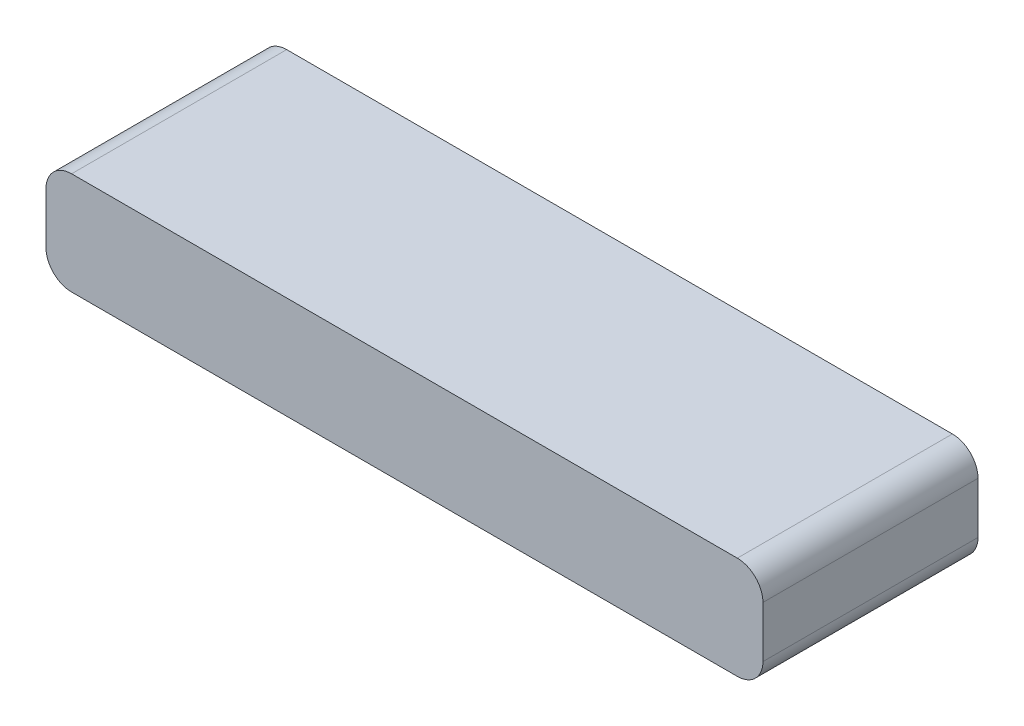
ISO-10303-21;
HEADER;
FILE_DESCRIPTION(('STEP AP214'),'2;1');
FILE_NAME('part.step','',(''),(''),'','','');
FILE_SCHEMA(('AUTOMOTIVE_DESIGN { 1 0 10303 214 1 1 1 1 }'));
ENDSEC;
DATA;
#1=APPLICATION_CONTEXT('core data for automotive mechanical design processes');
#2=APPLICATION_PROTOCOL_DEFINITION('international standard','automotive_design',2000,#1);
#3=PRODUCT_CONTEXT('',#1,'mechanical');
#4=PRODUCT('Part','Part','',(#3));
#5=PRODUCT_RELATED_PRODUCT_CATEGORY('part','',(#4));
#6=PRODUCT_DEFINITION_FORMATION('','',#4);
#7=PRODUCT_DEFINITION_CONTEXT('part definition',#1,'design');
#8=PRODUCT_DEFINITION('design','',#6,#7);
#9=PRODUCT_DEFINITION_SHAPE('','',#8);
#10=(LENGTH_UNIT() NAMED_UNIT(*) SI_UNIT(.MILLI.,.METRE.));
#11=(NAMED_UNIT(*) PLANE_ANGLE_UNIT() SI_UNIT($,.RADIAN.));
#12=(NAMED_UNIT(*) SI_UNIT($,.STERADIAN.) SOLID_ANGLE_UNIT());
#13=UNCERTAINTY_MEASURE_WITH_UNIT(LENGTH_MEASURE(1.E-05),#10,'distance_accuracy_value','');
#14=(GEOMETRIC_REPRESENTATION_CONTEXT(3) GLOBAL_UNCERTAINTY_ASSIGNED_CONTEXT((#13)) GLOBAL_UNIT_ASSIGNED_CONTEXT((#10,
#11,#12)) REPRESENTATION_CONTEXT('',''));
#15=CARTESIAN_POINT('',(0.,0.,0.));
#16=DIRECTION('',(0.,0.,1.));
#17=DIRECTION('',(1.,0.,0.));
#18=AXIS2_PLACEMENT_3D('',#15,#16,#17);
#19=CARTESIAN_POINT('',(0.,0.,0.));
#20=DIRECTION('',(0.,1.,0.));
#21=DIRECTION('',(0.,0.,1.));
#22=AXIS2_PLACEMENT_3D('',#19,#20,#21);
#23=PLANE('',#22);
#24=DIRECTION('',(1.,0.,0.));
#25=VECTOR('',#24,1.);
#26=CARTESIAN_POINT('',(-70.,0.,21.));
#27=LINE('',#26,#25);
#28=CARTESIAN_POINT('',(-65.,0.,21.));
#29=VERTEX_POINT('',#28);
#30=CARTESIAN_POINT('',(65.,0.,21.));
#31=VERTEX_POINT('',#30);
#32=EDGE_CURVE('E152',#29,#31,#27,.T.);
#33=ORIENTED_EDGE('',*,*,#32,.F.);
#34=DIRECTION('',(0.,0.,1.));
#35=VECTOR('',#34,1.);
#36=CARTESIAN_POINT('',(-65.,0.,0.));
#37=LINE('',#36,#35);
#38=CARTESIAN_POINT('',(-65.,0.,-21.));
#39=VERTEX_POINT('',#38);
#40=EDGE_CURVE('E56',#29,#39,#37,.F.);
#41=ORIENTED_EDGE('',*,*,#40,.T.);
#42=DIRECTION('',(-1.,0.,0.));
#43=VECTOR('',#42,1.);
#44=CARTESIAN_POINT('',(-70.,0.,-21.));
#45=LINE('',#44,#43);
#46=CARTESIAN_POINT('',(65.,0.,-21.));
#47=VERTEX_POINT('',#46);
#48=EDGE_CURVE('E150',#47,#39,#45,.T.);
#49=ORIENTED_EDGE('',*,*,#48,.F.);
#50=DIRECTION('',(0.,0.,-1.));
#51=VECTOR('',#50,1.);
#52=CARTESIAN_POINT('',(65.,0.,0.));
#53=LINE('',#52,#51);
#54=EDGE_CURVE('E203',#47,#31,#53,.F.);
#55=ORIENTED_EDGE('',*,*,#54,.T.);
#56=EDGE_LOOP('',(#33,#41,#49,#55));
#57=FACE_BOUND('',#56,.T.);
#58=DIRECTION('',(0.,0.,1.));
#59=VECTOR('',#58,1.);
#60=CARTESIAN_POINT('',(10.5725411137818,0.,12.4334762630116));
#61=LINE('',#60,#59);
#62=CARTESIAN_POINT('',(10.5725411137818,0.,5.));
#63=VERTEX_POINT('',#62);
#64=CARTESIAN_POINT('',(10.5725411137818,0.,12.4334762630116));
#65=VERTEX_POINT('',#64);
#66=EDGE_CURVE('E149',#63,#65,#61,.T.);
#67=ORIENTED_EDGE('',*,*,#66,.F.);
#68=DIRECTION('',(1.,0.,0.));
#69=VECTOR('',#68,1.);
#70=CARTESIAN_POINT('',(-10.5725411137818,0.,5.));
#71=LINE('',#70,#69);
#72=CARTESIAN_POINT('',(-10.5725411137818,0.,5.));
#73=VERTEX_POINT('',#72);
#74=EDGE_CURVE('E146',#73,#63,#71,.T.);
#75=ORIENTED_EDGE('',*,*,#74,.F.);
#76=DIRECTION('',(0.,0.,-1.));
#77=VECTOR('',#76,1.);
#78=CARTESIAN_POINT('',(-10.5725411137818,0.,12.4334762630116));
#79=LINE('',#78,#77);
#80=CARTESIAN_POINT('',(-10.5725411137818,0.,12.4334762630116));
#81=VERTEX_POINT('',#80);
#82=EDGE_CURVE('E365',#81,#73,#79,.T.);
#83=ORIENTED_EDGE('',*,*,#82,.F.);
#84=DIRECTION('',(-1.,0.,0.));
#85=VECTOR('',#84,1.);
#86=CARTESIAN_POINT('',(-10.5725411137818,0.,12.4334762630116));
#87=LINE('',#86,#85);
#88=EDGE_CURVE('E371',#65,#81,#87,.T.);
#89=ORIENTED_EDGE('',*,*,#88,.F.);
#90=EDGE_LOOP('',(#67,#75,#83,#89));
#91=FACE_BOUND('',#90,.T.);
#92=ADVANCED_FACE('F34',(#57,#91),#23,.F.);
#93=CARTESIAN_POINT('',(70.,20.,-21.));
#94=DIRECTION('',(-1.,0.,0.));
#95=DIRECTION('',(0.,0.,1.));
#96=AXIS2_PLACEMENT_3D('',#93,#94,#95);
#97=PLANE('',#96);
#98=DIRECTION('',(0.,-1.,0.));
#99=VECTOR('',#98,1.);
#100=CARTESIAN_POINT('',(70.,20.,21.));
#101=LINE('',#100,#99);
#102=CARTESIAN_POINT('',(70.,15.,21.));
#103=VERTEX_POINT('',#102);
#104=CARTESIAN_POINT('',(70.,5.,21.));
#105=VERTEX_POINT('',#104);
#106=EDGE_CURVE('E163',#103,#105,#101,.T.);
#107=ORIENTED_EDGE('',*,*,#106,.T.);
#108=DIRECTION('',(0.,0.,-1.));
#109=VECTOR('',#108,1.);
#110=CARTESIAN_POINT('',(70.,5.,-21.));
#111=LINE('',#110,#109);
#112=CARTESIAN_POINT('',(70.,5.,-21.));
#113=VERTEX_POINT('',#112);
#114=EDGE_CURVE('E11',#105,#113,#111,.T.);
#115=ORIENTED_EDGE('',*,*,#114,.T.);
#116=DIRECTION('',(0.,-1.,0.));
#117=VECTOR('',#116,1.);
#118=CARTESIAN_POINT('',(70.,20.,-21.));
#119=LINE('',#118,#117);
#120=CARTESIAN_POINT('',(70.,15.,-21.));
#121=VERTEX_POINT('',#120);
#122=EDGE_CURVE('E175',#121,#113,#119,.T.);
#123=ORIENTED_EDGE('',*,*,#122,.F.);
#124=DIRECTION('',(0.,0.,-1.));
#125=VECTOR('',#124,1.);
#126=CARTESIAN_POINT('',(70.,15.,21.));
#127=LINE('',#126,#125);
#128=EDGE_CURVE('E194',#121,#103,#127,.F.);
#129=ORIENTED_EDGE('',*,*,#128,.T.);
#130=EDGE_LOOP('',(#107,#115,#123,#129));
#131=FACE_BOUND('',#130,.T.);
#132=ADVANCED_FACE('F225',(#131),#97,.F.);
#133=CARTESIAN_POINT('',(-70.,20.,-21.));
#134=DIRECTION('',(0.,0.,1.));
#135=DIRECTION('',(1.,0.,0.));
#136=AXIS2_PLACEMENT_3D('',#133,#134,#135);
#137=PLANE('',#136);
#138=ORIENTED_EDGE('',*,*,#48,.T.);
#139=CARTESIAN_POINT('',(-65.,5.,-21.));
#140=DIRECTION('',(0.,0.,1.));
#141=DIRECTION('',(1.,0.,0.));
#142=AXIS2_PLACEMENT_3D('',#139,#140,#141);
#143=CIRCLE('',#142,5.);
#144=CARTESIAN_POINT('',(-70.,5.,-21.));
#145=VERTEX_POINT('',#144);
#146=EDGE_CURVE('E42',#39,#145,#143,.F.);
#147=ORIENTED_EDGE('',*,*,#146,.T.);
#148=DIRECTION('',(0.,-1.,0.));
#149=VECTOR('',#148,1.);
#150=CARTESIAN_POINT('',(-70.,20.,-21.));
#151=LINE('',#150,#149);
#152=CARTESIAN_POINT('',(-70.,15.,-21.));
#153=VERTEX_POINT('',#152);
#154=EDGE_CURVE('E172',#153,#145,#151,.T.);
#155=ORIENTED_EDGE('',*,*,#154,.F.);
#156=CARTESIAN_POINT('',(-65.,15.,-21.));
#157=DIRECTION('',(0.,0.,1.));
#158=DIRECTION('',(1.,0.,0.));
#159=AXIS2_PLACEMENT_3D('',#156,#157,#158);
#160=CIRCLE('',#159,5.);
#161=CARTESIAN_POINT('',(-65.,20.,-21.));
#162=VERTEX_POINT('',#161);
#163=EDGE_CURVE('E192',#153,#162,#160,.F.);
#164=ORIENTED_EDGE('',*,*,#163,.T.);
#165=DIRECTION('',(-1.,0.,0.));
#166=VECTOR('',#165,1.);
#167=CARTESIAN_POINT('',(-70.,20.,-21.));
#168=LINE('',#167,#166);
#169=CARTESIAN_POINT('',(65.,20.,-21.));
#170=VERTEX_POINT('',#169);
#171=EDGE_CURVE('E158',#170,#162,#168,.T.);
#172=ORIENTED_EDGE('',*,*,#171,.F.);
#173=CARTESIAN_POINT('',(65.,15.,-21.));
#174=DIRECTION('',(0.,0.,1.));
#175=DIRECTION('',(1.,0.,0.));
#176=AXIS2_PLACEMENT_3D('',#173,#174,#175);
#177=CIRCLE('',#176,5.);
#178=EDGE_CURVE('E190',#170,#121,#177,.F.);
#179=ORIENTED_EDGE('',*,*,#178,.T.);
#180=ORIENTED_EDGE('',*,*,#122,.T.);
#181=CARTESIAN_POINT('',(65.,5.,-21.));
#182=DIRECTION('',(0.,0.,1.));
#183=DIRECTION('',(1.,0.,0.));
#184=AXIS2_PLACEMENT_3D('',#181,#182,#183);
#185=CIRCLE('',#184,5.);
#186=EDGE_CURVE('E49',#113,#47,#185,.F.);
#187=ORIENTED_EDGE('',*,*,#186,.T.);
#188=EDGE_LOOP('',(#138,#147,#155,#164,#172,#179,#180,#187));
#189=FACE_BOUND('',#188,.T.);
#190=ADVANCED_FACE('F209',(#189),#137,.F.);
#191=CARTESIAN_POINT('',(-70.,20.,-21.));
#192=DIRECTION('',(1.,0.,0.));
#193=DIRECTION('',(0.,0.,-1.));
#194=AXIS2_PLACEMENT_3D('',#191,#192,#193);
#195=PLANE('',#194);
#196=ORIENTED_EDGE('',*,*,#154,.T.);
#197=DIRECTION('',(0.,0.,1.));
#198=VECTOR('',#197,1.);
#199=CARTESIAN_POINT('',(-70.,5.,-21.));
#200=LINE('',#199,#198);
#201=CARTESIAN_POINT('',(-70.,5.,21.));
#202=VERTEX_POINT('',#201);
#203=EDGE_CURVE('E196',#145,#202,#200,.T.);
#204=ORIENTED_EDGE('',*,*,#203,.T.);
#205=DIRECTION('',(0.,-1.,0.));
#206=VECTOR('',#205,1.);
#207=CARTESIAN_POINT('',(-70.,20.,21.));
#208=LINE('',#207,#206);
#209=CARTESIAN_POINT('',(-70.,15.,21.));
#210=VERTEX_POINT('',#209);
#211=EDGE_CURVE('E169',#210,#202,#208,.T.);
#212=ORIENTED_EDGE('',*,*,#211,.F.);
#213=DIRECTION('',(0.,0.,1.));
#214=VECTOR('',#213,1.);
#215=CARTESIAN_POINT('',(-70.,15.,-21.));
#216=LINE('',#215,#214);
#217=EDGE_CURVE('E188',#210,#153,#216,.F.);
#218=ORIENTED_EDGE('',*,*,#217,.T.);
#219=EDGE_LOOP('',(#196,#204,#212,#218));
#220=FACE_BOUND('',#219,.T.);
#221=ADVANCED_FACE('F214',(#220),#195,.F.);
#222=CARTESIAN_POINT('',(-70.,20.,21.));
#223=DIRECTION('',(0.,0.,-1.));
#224=DIRECTION('',(-1.,0.,0.));
#225=AXIS2_PLACEMENT_3D('',#222,#223,#224);
#226=PLANE('',#225);
#227=ORIENTED_EDGE('',*,*,#211,.T.);
#228=CARTESIAN_POINT('',(-65.,5.,21.));
#229=DIRECTION('',(0.,0.,-1.));
#230=DIRECTION('',(-1.,0.,0.));
#231=AXIS2_PLACEMENT_3D('',#228,#229,#230);
#232=CIRCLE('',#231,5.);
#233=EDGE_CURVE('E201',#202,#29,#232,.F.);
#234=ORIENTED_EDGE('',*,*,#233,.T.);
#235=ORIENTED_EDGE('',*,*,#32,.T.);
#236=CARTESIAN_POINT('',(65.,5.,21.));
#237=DIRECTION('',(0.,0.,-1.));
#238=DIRECTION('',(-1.,0.,0.));
#239=AXIS2_PLACEMENT_3D('',#236,#237,#238);
#240=CIRCLE('',#239,5.);
#241=EDGE_CURVE('E199',#31,#105,#240,.F.);
#242=ORIENTED_EDGE('',*,*,#241,.T.);
#243=ORIENTED_EDGE('',*,*,#106,.F.);
#244=CARTESIAN_POINT('',(65.,15.,21.));
#245=DIRECTION('',(0.,0.,-1.));
#246=DIRECTION('',(-1.,0.,0.));
#247=AXIS2_PLACEMENT_3D('',#244,#245,#246);
#248=CIRCLE('',#247,5.);
#249=CARTESIAN_POINT('',(65.,20.,21.));
#250=VERTEX_POINT('',#249);
#251=EDGE_CURVE('E184',#103,#250,#248,.F.);
#252=ORIENTED_EDGE('',*,*,#251,.T.);
#253=DIRECTION('',(1.,0.,0.));
#254=VECTOR('',#253,1.);
#255=CARTESIAN_POINT('',(-70.,20.,21.));
#256=LINE('',#255,#254);
#257=CARTESIAN_POINT('',(-65.,20.,21.));
#258=VERTEX_POINT('',#257);
#259=EDGE_CURVE('E161',#258,#250,#256,.T.);
#260=ORIENTED_EDGE('',*,*,#259,.F.);
#261=CARTESIAN_POINT('',(-65.,15.,21.));
#262=DIRECTION('',(0.,0.,-1.));
#263=DIRECTION('',(-1.,0.,0.));
#264=AXIS2_PLACEMENT_3D('',#261,#262,#263);
#265=CIRCLE('',#264,5.);
#266=EDGE_CURVE('E186',#258,#210,#265,.F.);
#267=ORIENTED_EDGE('',*,*,#266,.T.);
#268=EDGE_LOOP('',(#227,#234,#235,#242,#243,#252,#260,#267));
#269=FACE_BOUND('',#268,.T.);
#270=ADVANCED_FACE('F219',(#269),#226,.F.);
#271=CARTESIAN_POINT('',(0.,20.,0.));
#272=DIRECTION('',(0.,1.,0.));
#273=DIRECTION('',(0.,0.,1.));
#274=AXIS2_PLACEMENT_3D('',#271,#272,#273);
#275=PLANE('',#274);
#276=ORIENTED_EDGE('',*,*,#171,.T.);
#277=DIRECTION('',(0.,0.,1.));
#278=VECTOR('',#277,1.);
#279=CARTESIAN_POINT('',(-65.,20.,21.));
#280=LINE('',#279,#278);
#281=EDGE_CURVE('E181',#162,#258,#280,.T.);
#282=ORIENTED_EDGE('',*,*,#281,.T.);
#283=ORIENTED_EDGE('',*,*,#259,.T.);
#284=DIRECTION('',(0.,0.,-1.));
#285=VECTOR('',#284,1.);
#286=CARTESIAN_POINT('',(65.,20.,-21.));
#287=LINE('',#286,#285);
#288=EDGE_CURVE('E178',#250,#170,#287,.T.);
#289=ORIENTED_EDGE('',*,*,#288,.T.);
#290=EDGE_LOOP('',(#276,#282,#283,#289));
#291=FACE_BOUND('',#290,.T.);
#292=ADVANCED_FACE('F233',(#291),#275,.T.);
#293=CARTESIAN_POINT('',(10.5725411137818,-4.,12.4334762630116));
#294=DIRECTION('',(-1.,0.,0.));
#295=DIRECTION('',(0.,0.,1.));
#296=AXIS2_PLACEMENT_3D('',#293,#294,#295);
#297=PLANE('',#296);
#298=ORIENTED_EDGE('',*,*,#66,.T.);
#299=DIRECTION('',(0.,1.,0.));
#300=VECTOR('',#299,1.);
#301=CARTESIAN_POINT('',(10.5725411137818,-4.,12.4334762630116));
#302=LINE('',#301,#300);
#303=CARTESIAN_POINT('',(10.5725411137818,-4.,12.4334762630116));
#304=VERTEX_POINT('',#303);
#305=EDGE_CURVE('E130',#304,#65,#302,.T.);
#306=ORIENTED_EDGE('',*,*,#305,.F.);
#307=DIRECTION('',(0.,0.,1.));
#308=VECTOR('',#307,1.);
#309=CARTESIAN_POINT('',(10.5725411137818,-4.,12.4334762630116));
#310=LINE('',#309,#308);
#311=CARTESIAN_POINT('',(10.5725411137818,-4.,5.));
#312=VERTEX_POINT('',#311);
#313=EDGE_CURVE('E137',#312,#304,#310,.T.);
#314=ORIENTED_EDGE('',*,*,#313,.F.);
#315=DIRECTION('',(0.,1.,0.));
#316=VECTOR('',#315,1.);
#317=CARTESIAN_POINT('',(10.5725411137818,-4.,5.));
#318=LINE('',#317,#316);
#319=EDGE_CURVE('E362',#312,#63,#318,.T.);
#320=ORIENTED_EDGE('',*,*,#319,.T.);
#321=EDGE_LOOP('',(#298,#306,#314,#320));
#322=FACE_BOUND('',#321,.T.);
#323=ADVANCED_FACE('F148',(#322),#297,.F.);
#324=CARTESIAN_POINT('',(-10.5725411137818,-4.,12.4334762630116));
#325=DIRECTION('',(0.,0.,-1.));
#326=DIRECTION('',(-1.,0.,0.));
#327=AXIS2_PLACEMENT_3D('',#324,#325,#326);
#328=PLANE('',#327);
#329=ORIENTED_EDGE('',*,*,#88,.T.);
#330=DIRECTION('',(0.,1.,0.));
#331=VECTOR('',#330,1.);
#332=CARTESIAN_POINT('',(-10.5725411137818,-4.,12.4334762630116));
#333=LINE('',#332,#331);
#334=CARTESIAN_POINT('',(-10.5725411137818,-4.,12.4334762630116));
#335=VERTEX_POINT('',#334);
#336=EDGE_CURVE('E133',#335,#81,#333,.T.);
#337=ORIENTED_EDGE('',*,*,#336,.F.);
#338=DIRECTION('',(-1.,0.,0.));
#339=VECTOR('',#338,1.);
#340=CARTESIAN_POINT('',(-10.5725411137818,-4.,12.4334762630116));
#341=LINE('',#340,#339);
#342=EDGE_CURVE('E125',#304,#335,#341,.T.);
#343=ORIENTED_EDGE('',*,*,#342,.F.);
#344=ORIENTED_EDGE('',*,*,#305,.T.);
#345=EDGE_LOOP('',(#329,#337,#343,#344));
#346=FACE_BOUND('',#345,.T.);
#347=ADVANCED_FACE('F128',(#346),#328,.F.);
#348=CARTESIAN_POINT('',(-10.5725411137818,-4.,12.4334762630116));
#349=DIRECTION('',(1.,0.,0.));
#350=DIRECTION('',(0.,0.,-1.));
#351=AXIS2_PLACEMENT_3D('',#348,#349,#350);
#352=PLANE('',#351);
#353=ORIENTED_EDGE('',*,*,#82,.T.);
#354=DIRECTION('',(0.,1.,0.));
#355=VECTOR('',#354,1.);
#356=CARTESIAN_POINT('',(-10.5725411137818,-4.,5.));
#357=LINE('',#356,#355);
#358=CARTESIAN_POINT('',(-10.5725411137818,-4.,5.));
#359=VERTEX_POINT('',#358);
#360=EDGE_CURVE('E154',#359,#73,#357,.T.);
#361=ORIENTED_EDGE('',*,*,#360,.F.);
#362=DIRECTION('',(0.,0.,-1.));
#363=VECTOR('',#362,1.);
#364=CARTESIAN_POINT('',(-10.5725411137818,-4.,12.4334762630116));
#365=LINE('',#364,#363);
#366=EDGE_CURVE('E136',#335,#359,#365,.T.);
#367=ORIENTED_EDGE('',*,*,#366,.F.);
#368=ORIENTED_EDGE('',*,*,#336,.T.);
#369=EDGE_LOOP('',(#353,#361,#367,#368));
#370=FACE_BOUND('',#369,.T.);
#371=ADVANCED_FACE('F291',(#370),#352,.F.);
#372=CARTESIAN_POINT('',(-10.5725411137818,-4.,5.));
#373=DIRECTION('',(0.,0.,1.));
#374=DIRECTION('',(1.,0.,0.));
#375=AXIS2_PLACEMENT_3D('',#372,#373,#374);
#376=PLANE('',#375);
#377=ORIENTED_EDGE('',*,*,#74,.T.);
#378=ORIENTED_EDGE('',*,*,#319,.F.);
#379=DIRECTION('',(1.,0.,0.));
#380=VECTOR('',#379,1.);
#381=CARTESIAN_POINT('',(-10.5725411137818,-4.,5.));
#382=LINE('',#381,#380);
#383=EDGE_CURVE('E142',#359,#312,#382,.T.);
#384=ORIENTED_EDGE('',*,*,#383,.F.);
#385=ORIENTED_EDGE('',*,*,#360,.T.);
#386=EDGE_LOOP('',(#377,#378,#384,#385));
#387=FACE_BOUND('',#386,.T.);
#388=ADVANCED_FACE('F245',(#387),#376,.F.);
#389=CARTESIAN_POINT('',(0.,-4.,0.));
#390=DIRECTION('',(0.,-1.,0.));
#391=DIRECTION('',(0.,0.,-1.));
#392=AXIS2_PLACEMENT_3D('',#389,#390,#391);
#393=PLANE('',#392);
#394=ORIENTED_EDGE('',*,*,#313,.T.);
#395=ORIENTED_EDGE('',*,*,#342,.T.);
#396=ORIENTED_EDGE('',*,*,#366,.T.);
#397=ORIENTED_EDGE('',*,*,#383,.T.);
#398=EDGE_LOOP('',(#394,#395,#396,#397));
#399=FACE_BOUND('',#398,.T.);
#400=ADVANCED_FACE('F140',(#399),#393,.T.);
#401=CARTESIAN_POINT('',(-65.,15.,0.));
#402=DIRECTION('',(0.,0.,-1.));
#403=DIRECTION('',(-1.,0.,0.));
#404=AXIS2_PLACEMENT_3D('',#401,#402,#403);
#405=CYLINDRICAL_SURFACE('',#404,5.);
#406=ORIENTED_EDGE('',*,*,#163,.F.);
#407=ORIENTED_EDGE('',*,*,#217,.F.);
#408=ORIENTED_EDGE('',*,*,#266,.F.);
#409=ORIENTED_EDGE('',*,*,#281,.F.);
#410=EDGE_LOOP('',(#406,#407,#408,#409));
#411=FACE_BOUND('',#410,.T.);
#412=ADVANCED_FACE('F237',(#411),#405,.T.);
#413=CARTESIAN_POINT('',(65.,15.,0.));
#414=DIRECTION('',(0.,0.,1.));
#415=DIRECTION('',(1.,0.,0.));
#416=AXIS2_PLACEMENT_3D('',#413,#414,#415);
#417=CYLINDRICAL_SURFACE('',#416,5.);
#418=ORIENTED_EDGE('',*,*,#251,.F.);
#419=ORIENTED_EDGE('',*,*,#128,.F.);
#420=ORIENTED_EDGE('',*,*,#178,.F.);
#421=ORIENTED_EDGE('',*,*,#288,.F.);
#422=EDGE_LOOP('',(#418,#419,#420,#421));
#423=FACE_BOUND('',#422,.T.);
#424=ADVANCED_FACE('F229',(#423),#417,.T.);
#425=CARTESIAN_POINT('',(-65.,5.,-21.));
#426=DIRECTION('',(0.,0.,1.));
#427=DIRECTION('',(1.,0.,0.));
#428=AXIS2_PLACEMENT_3D('',#425,#426,#427);
#429=CYLINDRICAL_SURFACE('',#428,5.);
#430=ORIENTED_EDGE('',*,*,#146,.F.);
#431=ORIENTED_EDGE('',*,*,#40,.F.);
#432=ORIENTED_EDGE('',*,*,#233,.F.);
#433=ORIENTED_EDGE('',*,*,#203,.F.);
#434=EDGE_LOOP('',(#430,#431,#432,#433));
#435=FACE_BOUND('',#434,.T.);
#436=ADVANCED_FACE('F217',(#435),#429,.T.);
#437=CARTESIAN_POINT('',(65.,5.,-21.));
#438=DIRECTION('',(0.,0.,-1.));
#439=DIRECTION('',(-1.,0.,0.));
#440=AXIS2_PLACEMENT_3D('',#437,#438,#439);
#441=CYLINDRICAL_SURFACE('',#440,5.);
#442=ORIENTED_EDGE('',*,*,#241,.F.);
#443=ORIENTED_EDGE('',*,*,#54,.F.);
#444=ORIENTED_EDGE('',*,*,#186,.F.);
#445=ORIENTED_EDGE('',*,*,#114,.F.);
#446=EDGE_LOOP('',(#442,#443,#444,#445));
#447=FACE_BOUND('',#446,.T.);
#448=ADVANCED_FACE('F36',(#447),#441,.T.);
#449=CLOSED_SHELL('',(#92,#132,#190,#221,#270,#292,#323,#347,#371,#388,#400,#412,#424,#436,#448));
#450=MANIFOLD_SOLID_BREP('B2',#449);
#451=ADVANCED_BREP_SHAPE_REPRESENTATION('',(#18,#450),#14);
#452=SHAPE_DEFINITION_REPRESENTATION(#9,#451);
ENDSEC;
END-ISO-10303-21;
